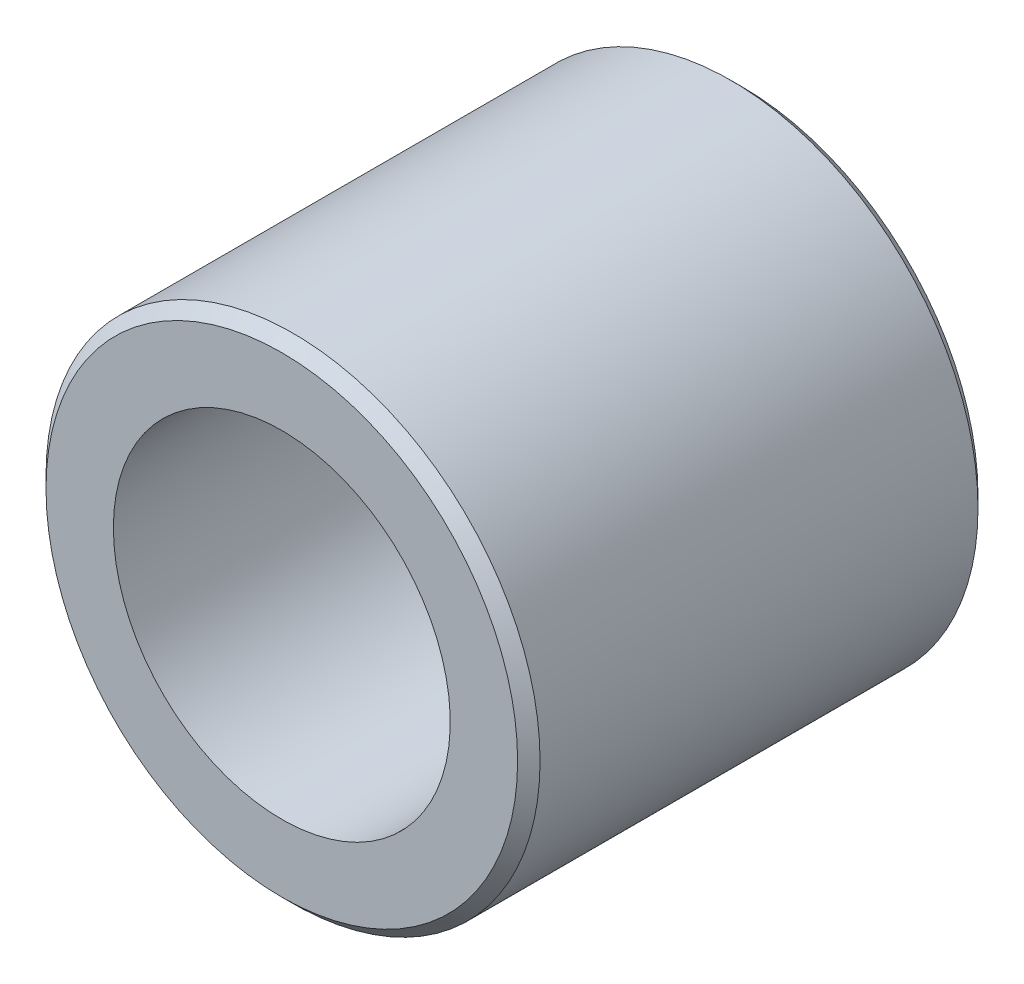
ISO-10303-21;
HEADER;
FILE_DESCRIPTION(('STEP AP214'),'2;1');
FILE_NAME('part.step','',(''),(''),'','','');
FILE_SCHEMA(('AUTOMOTIVE_DESIGN { 1 0 10303 214 1 1 1 1 }'));
ENDSEC;
DATA;
#1=APPLICATION_CONTEXT('core data for automotive mechanical design processes');
#2=APPLICATION_PROTOCOL_DEFINITION('international standard','automotive_design',2000,#1);
#3=PRODUCT_CONTEXT('',#1,'mechanical');
#4=PRODUCT('Part','Part','',(#3));
#5=PRODUCT_RELATED_PRODUCT_CATEGORY('part','',(#4));
#6=PRODUCT_DEFINITION_FORMATION('','',#4);
#7=PRODUCT_DEFINITION_CONTEXT('part definition',#1,'design');
#8=PRODUCT_DEFINITION('design','',#6,#7);
#9=PRODUCT_DEFINITION_SHAPE('','',#8);
#10=(LENGTH_UNIT() NAMED_UNIT(*) SI_UNIT(.MILLI.,.METRE.));
#11=(NAMED_UNIT(*) PLANE_ANGLE_UNIT() SI_UNIT($,.RADIAN.));
#12=(NAMED_UNIT(*) SI_UNIT($,.STERADIAN.) SOLID_ANGLE_UNIT());
#13=UNCERTAINTY_MEASURE_WITH_UNIT(LENGTH_MEASURE(1.E-05),#10,'distance_accuracy_value','');
#14=(GEOMETRIC_REPRESENTATION_CONTEXT(3) GLOBAL_UNCERTAINTY_ASSIGNED_CONTEXT((#13)) GLOBAL_UNIT_ASSIGNED_CONTEXT((#10,
#11,#12)) REPRESENTATION_CONTEXT('',''));
#15=CARTESIAN_POINT('',(0.,0.,0.));
#16=DIRECTION('',(0.,0.,1.));
#17=DIRECTION('',(1.,0.,0.));
#18=AXIS2_PLACEMENT_3D('',#15,#16,#17);
#19=CARTESIAN_POINT('',(0.,0.,10.25));
#20=DIRECTION('',(0.,0.,-1.));
#21=DIRECTION('',(-1.,0.,0.));
#22=AXIS2_PLACEMENT_3D('',#19,#20,#21);
#23=CYLINDRICAL_SURFACE('',#22,7.5);
#24=CARTESIAN_POINT('',(0.,0.,-10.25));
#25=DIRECTION('',(0.,0.,-1.));
#26=DIRECTION('',(-1.,0.,0.));
#27=AXIS2_PLACEMENT_3D('',#24,#25,#26);
#28=CIRCLE('',#27,7.5);
#29=CARTESIAN_POINT('',(-7.5,0.,-10.25));
#30=VERTEX_POINT('',#29);
#31=EDGE_CURVE('E38',#30,#30,#28,.T.);
#32=ORIENTED_EDGE('',*,*,#31,.T.);
#33=EDGE_LOOP('',(#32));
#34=FACE_BOUND('',#33,.T.);
#35=CARTESIAN_POINT('',(0.,0.,10.25));
#36=DIRECTION('',(0.,0.,-1.));
#37=DIRECTION('',(-1.,0.,0.));
#38=AXIS2_PLACEMENT_3D('',#35,#36,#37);
#39=CIRCLE('',#38,7.5);
#40=CARTESIAN_POINT('',(-7.5,0.,10.25));
#41=VERTEX_POINT('',#40);
#42=EDGE_CURVE('E18',#41,#41,#39,.T.);
#43=ORIENTED_EDGE('',*,*,#42,.F.);
#44=EDGE_LOOP('',(#43));
#45=FACE_BOUND('',#44,.T.);
#46=ADVANCED_FACE('F15',(#34,#45),#23,.F.);
#47=CARTESIAN_POINT('',(0.,0.,10.25));
#48=DIRECTION('',(0.,0.,1.));
#49=DIRECTION('',(1.,0.,0.));
#50=AXIS2_PLACEMENT_3D('',#47,#48,#49);
#51=PLANE('',#50);
#52=ORIENTED_EDGE('',*,*,#42,.T.);
#53=EDGE_LOOP('',(#52));
#54=FACE_BOUND('',#53,.T.);
#55=CARTESIAN_POINT('',(0.,0.,10.25));
#56=DIRECTION('',(0.,0.,-1.));
#57=DIRECTION('',(-1.,0.,0.));
#58=AXIS2_PLACEMENT_3D('',#55,#56,#57);
#59=CIRCLE('',#58,10.5);
#60=CARTESIAN_POINT('',(-10.5,0.,10.25));
#61=VERTEX_POINT('',#60);
#62=EDGE_CURVE('E36',#61,#61,#59,.T.);
#63=ORIENTED_EDGE('',*,*,#62,.F.);
#64=EDGE_LOOP('',(#63));
#65=FACE_BOUND('',#64,.T.);
#66=ADVANCED_FACE('F45',(#54,#65),#51,.T.);
#67=CARTESIAN_POINT('',(0.,0.,-10.25));
#68=DIRECTION('',(0.,0.,1.));
#69=DIRECTION('',(1.,0.,0.));
#70=AXIS2_PLACEMENT_3D('',#67,#68,#69);
#71=PLANE('',#70);
#72=ORIENTED_EDGE('',*,*,#31,.F.);
#73=EDGE_LOOP('',(#72));
#74=FACE_BOUND('',#73,.T.);
#75=CARTESIAN_POINT('',(0.,0.,-10.2500000004487));
#76=DIRECTION('',(0.,0.,1.));
#77=DIRECTION('',(1.,0.,0.));
#78=AXIS2_PLACEMENT_3D('',#75,#76,#77);
#79=CIRCLE('',#78,10.5000000004487);
#80=CARTESIAN_POINT('',(10.5000000004487,0.,-10.2500000004487));
#81=VERTEX_POINT('',#80);
#82=EDGE_CURVE('E27',#81,#81,#79,.T.);
#83=ORIENTED_EDGE('',*,*,#82,.F.);
#84=EDGE_LOOP('',(#83));
#85=FACE_BOUND('',#84,.T.);
#86=ADVANCED_FACE('F53',(#74,#85),#71,.F.);
#87=CARTESIAN_POINT('',(0.,0.,9.74999999955127));
#88=DIRECTION('',(0.,0.,-1.));
#89=DIRECTION('',(-1.,0.,0.));
#90=AXIS2_PLACEMENT_3D('',#87,#88,#89);
#91=CONICAL_SURFACE('',#90,10.9999999995513,0.785398162499994);
#92=CARTESIAN_POINT('',(0.,0.,9.74999999999999));
#93=DIRECTION('',(0.,0.,-1.));
#94=DIRECTION('',(-1.,0.,0.));
#95=AXIS2_PLACEMENT_3D('',#92,#93,#94);
#96=CIRCLE('',#95,11.);
#97=CARTESIAN_POINT('',(-11.,0.,9.74999999999999));
#98=VERTEX_POINT('',#97);
#99=EDGE_CURVE('E22',#98,#98,#96,.T.);
#100=ORIENTED_EDGE('',*,*,#99,.F.);
#101=EDGE_LOOP('',(#100));
#102=FACE_BOUND('',#101,.T.);
#103=ORIENTED_EDGE('',*,*,#62,.T.);
#104=EDGE_LOOP('',(#103));
#105=FACE_BOUND('',#104,.T.);
#106=ADVANCED_FACE('F61',(#102,#105),#91,.T.);
#107=CARTESIAN_POINT('',(0.,0.,-9.75));
#108=DIRECTION('',(0.,0.,1.));
#109=DIRECTION('',(1.,0.,0.));
#110=AXIS2_PLACEMENT_3D('',#107,#108,#109);
#111=CONICAL_SURFACE('',#110,11.,0.785398162500003);
#112=CARTESIAN_POINT('',(0.,0.,-9.75));
#113=DIRECTION('',(0.,0.,-1.));
#114=DIRECTION('',(-1.,0.,0.));
#115=AXIS2_PLACEMENT_3D('',#112,#113,#114);
#116=CIRCLE('',#115,11.);
#117=CARTESIAN_POINT('',(-11.,0.,-9.75));
#118=VERTEX_POINT('',#117);
#119=EDGE_CURVE('E10',#118,#118,#116,.F.);
#120=ORIENTED_EDGE('',*,*,#119,.F.);
#121=EDGE_LOOP('',(#120));
#122=FACE_BOUND('',#121,.T.);
#123=ORIENTED_EDGE('',*,*,#82,.T.);
#124=EDGE_LOOP('',(#123));
#125=FACE_BOUND('',#124,.T.);
#126=ADVANCED_FACE('F56',(#122,#125),#111,.T.);
#127=CARTESIAN_POINT('',(0.,0.,10.25));
#128=DIRECTION('',(0.,0.,-1.));
#129=DIRECTION('',(-1.,0.,0.));
#130=AXIS2_PLACEMENT_3D('',#127,#128,#129);
#131=CYLINDRICAL_SURFACE('',#130,11.);
#132=ORIENTED_EDGE('',*,*,#119,.T.);
#133=EDGE_LOOP('',(#132));
#134=FACE_BOUND('',#133,.T.);
#135=ORIENTED_EDGE('',*,*,#99,.T.);
#136=EDGE_LOOP('',(#135));
#137=FACE_BOUND('',#136,.T.);
#138=ADVANCED_FACE('F54',(#134,#137),#131,.T.);
#139=CLOSED_SHELL('',(#46,#66,#86,#106,#126,#138));
#140=MANIFOLD_SOLID_BREP('B1',#139);
#141=ADVANCED_BREP_SHAPE_REPRESENTATION('',(#18,#140),#14);
#142=SHAPE_DEFINITION_REPRESENTATION(#9,#141);
ENDSEC;
END-ISO-10303-21;
